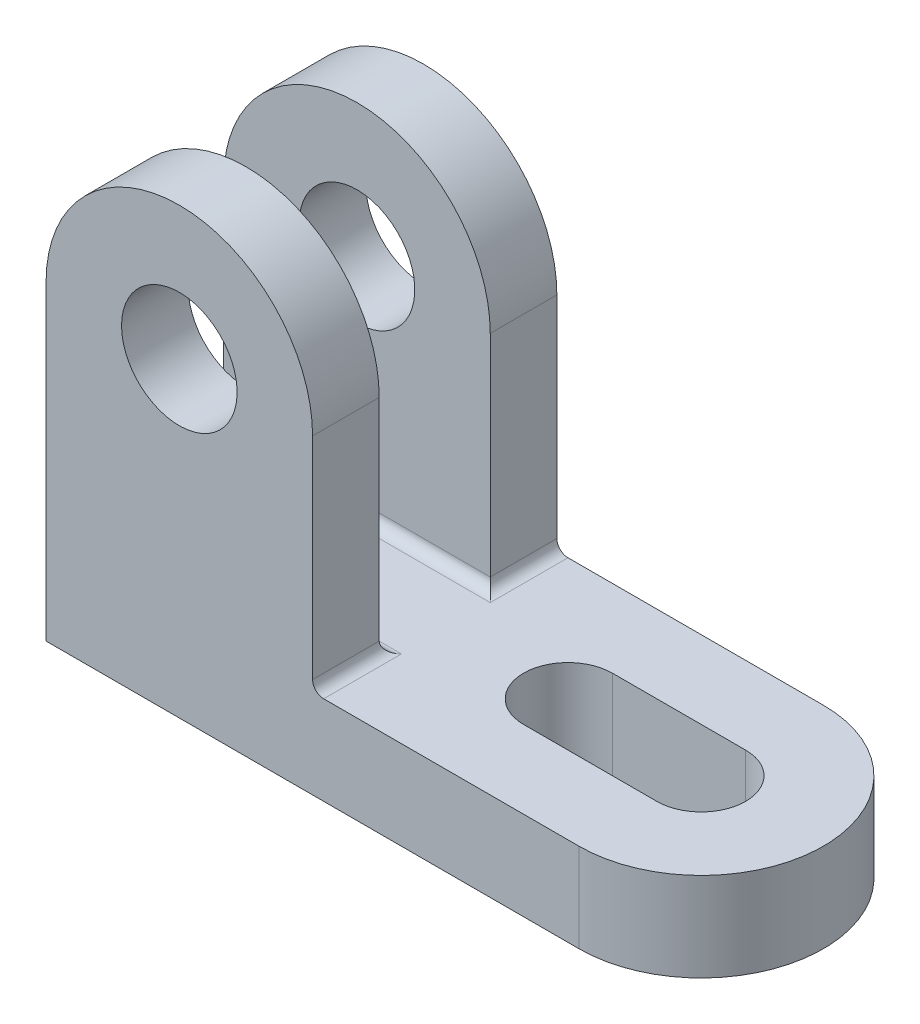
ISO-10303-21;
HEADER;
FILE_DESCRIPTION(('STEP AP214'),'2;1');
FILE_NAME('part.step','',(''),(''),'','','');
FILE_SCHEMA(('AUTOMOTIVE_DESIGN { 1 0 10303 214 1 1 1 1 }'));
ENDSEC;
DATA;
#1=APPLICATION_CONTEXT('core data for automotive mechanical design processes');
#2=APPLICATION_PROTOCOL_DEFINITION('international standard','automotive_design',2000,#1);
#3=PRODUCT_CONTEXT('',#1,'mechanical');
#4=PRODUCT('Part','Part','',(#3));
#5=PRODUCT_RELATED_PRODUCT_CATEGORY('part','',(#4));
#6=PRODUCT_DEFINITION_FORMATION('','',#4);
#7=PRODUCT_DEFINITION_CONTEXT('part definition',#1,'design');
#8=PRODUCT_DEFINITION('design','',#6,#7);
#9=PRODUCT_DEFINITION_SHAPE('','',#8);
#10=(LENGTH_UNIT() NAMED_UNIT(*) SI_UNIT(.MILLI.,.METRE.));
#11=(NAMED_UNIT(*) PLANE_ANGLE_UNIT() SI_UNIT($,.RADIAN.));
#12=(NAMED_UNIT(*) SI_UNIT($,.STERADIAN.) SOLID_ANGLE_UNIT());
#13=UNCERTAINTY_MEASURE_WITH_UNIT(LENGTH_MEASURE(1.E-05),#10,'distance_accuracy_value','');
#14=(GEOMETRIC_REPRESENTATION_CONTEXT(3) GLOBAL_UNCERTAINTY_ASSIGNED_CONTEXT((#13)) GLOBAL_UNIT_ASSIGNED_CONTEXT((#10,
#11,#12)) REPRESENTATION_CONTEXT('',''));
#15=CARTESIAN_POINT('',(0.,0.,0.));
#16=DIRECTION('',(0.,0.,1.));
#17=DIRECTION('',(1.,0.,0.));
#18=AXIS2_PLACEMENT_3D('',#15,#16,#17);
#19=CARTESIAN_POINT('',(-59.,16.,22.));
#20=DIRECTION('',(1.,0.,0.));
#21=DIRECTION('',(0.,0.,-1.));
#22=AXIS2_PLACEMENT_3D('',#19,#20,#21);
#23=PLANE('',#22);
#24=DIRECTION('',(0.,0.,1.));
#25=VECTOR('',#24,1.);
#26=CARTESIAN_POINT('',(-59.,0.,22.));
#27=LINE('',#26,#25);
#28=CARTESIAN_POINT('',(-59.,0.,-22.));
#29=VERTEX_POINT('',#28);
#30=CARTESIAN_POINT('',(-59.,0.,22.));
#31=VERTEX_POINT('',#30);
#32=EDGE_CURVE('E246',#29,#31,#27,.T.);
#33=ORIENTED_EDGE('',*,*,#32,.T.);
#34=DIRECTION('',(0.,-1.,0.));
#35=VECTOR('',#34,1.);
#36=CARTESIAN_POINT('',(-59.,16.,22.));
#37=LINE('',#36,#35);
#38=CARTESIAN_POINT('',(-59.,56.,22.));
#39=VERTEX_POINT('',#38);
#40=EDGE_CURVE('E173',#39,#31,#37,.T.);
#41=ORIENTED_EDGE('',*,*,#40,.F.);
#42=DIRECTION('',(0.,0.,1.));
#43=VECTOR('',#42,1.);
#44=CARTESIAN_POINT('',(-59.,56.,10.));
#45=LINE('',#44,#43);
#46=CARTESIAN_POINT('',(-59.,56.,10.));
#47=VERTEX_POINT('',#46);
#48=EDGE_CURVE('E170',#47,#39,#45,.T.);
#49=ORIENTED_EDGE('',*,*,#48,.F.);
#50=DIRECTION('',(0.,1.,0.));
#51=VECTOR('',#50,1.);
#52=CARTESIAN_POINT('',(-59.,0.,10.));
#53=LINE('',#52,#51);
#54=CARTESIAN_POINT('',(-59.,18.,10.));
#55=VERTEX_POINT('',#54);
#56=EDGE_CURVE('E158',#55,#47,#53,.T.);
#57=ORIENTED_EDGE('',*,*,#56,.F.);
#58=CARTESIAN_POINT('',(-59.,18.,8.));
#59=DIRECTION('',(1.,0.,0.));
#60=DIRECTION('',(0.,0.,-1.));
#61=AXIS2_PLACEMENT_3D('',#58,#59,#60);
#62=CIRCLE('',#61,2.);
#63=CARTESIAN_POINT('',(-59.,16.,8.));
#64=VERTEX_POINT('',#63);
#65=EDGE_CURVE('E11',#55,#64,#62,.T.);
#66=ORIENTED_EDGE('',*,*,#65,.T.);
#67=DIRECTION('',(0.,0.,1.));
#68=VECTOR('',#67,1.);
#69=CARTESIAN_POINT('',(-59.,16.,22.));
#70=LINE('',#69,#68);
#71=CARTESIAN_POINT('',(-59.,16.,-8.));
#72=VERTEX_POINT('',#71);
#73=EDGE_CURVE('E253',#72,#64,#70,.T.);
#74=ORIENTED_EDGE('',*,*,#73,.F.);
#75=CARTESIAN_POINT('',(-59.,18.,-8.));
#76=DIRECTION('',(1.,0.,0.));
#77=DIRECTION('',(0.,0.,-1.));
#78=AXIS2_PLACEMENT_3D('',#75,#76,#77);
#79=CIRCLE('',#78,2.);
#80=CARTESIAN_POINT('',(-59.,18.,-10.));
#81=VERTEX_POINT('',#80);
#82=EDGE_CURVE('E298',#72,#81,#79,.T.);
#83=ORIENTED_EDGE('',*,*,#82,.T.);
#84=DIRECTION('',(0.,1.,0.));
#85=VECTOR('',#84,1.);
#86=CARTESIAN_POINT('',(-59.,0.,-10.));
#87=LINE('',#86,#85);
#88=CARTESIAN_POINT('',(-59.,56.,-10.));
#89=VERTEX_POINT('',#88);
#90=EDGE_CURVE('E203',#81,#89,#87,.T.);
#91=ORIENTED_EDGE('',*,*,#90,.T.);
#92=DIRECTION('',(0.,0.,-1.));
#93=VECTOR('',#92,1.);
#94=CARTESIAN_POINT('',(-59.,56.,-10.));
#95=LINE('',#94,#93);
#96=CARTESIAN_POINT('',(-59.,56.,-22.));
#97=VERTEX_POINT('',#96);
#98=EDGE_CURVE('E215',#89,#97,#95,.T.);
#99=ORIENTED_EDGE('',*,*,#98,.T.);
#100=DIRECTION('',(0.,-1.,0.));
#101=VECTOR('',#100,1.);
#102=CARTESIAN_POINT('',(-59.,16.,-22.));
#103=LINE('',#102,#101);
#104=EDGE_CURVE('E264',#97,#29,#103,.T.);
#105=ORIENTED_EDGE('',*,*,#104,.T.);
#106=EDGE_LOOP('',(#33,#41,#49,#57,#66,#74,#83,#91,#99,#105));
#107=FACE_BOUND('',#106,.T.);
#108=ADVANCED_FACE('F39',(#107),#23,.F.);
#109=CARTESIAN_POINT('',(-59.,16.,22.));
#110=DIRECTION('',(0.,0.,-1.));
#111=DIRECTION('',(-1.,0.,0.));
#112=AXIS2_PLACEMENT_3D('',#109,#110,#111);
#113=PLANE('',#112);
#114=DIRECTION('',(1.,0.,0.));
#115=VECTOR('',#114,1.);
#116=CARTESIAN_POINT('',(-59.,0.,22.));
#117=LINE('',#116,#115);
#118=CARTESIAN_POINT('',(37.,0.,22.));
#119=VERTEX_POINT('',#118);
#120=EDGE_CURVE('E266',#31,#119,#117,.T.);
#121=ORIENTED_EDGE('',*,*,#120,.T.);
#122=DIRECTION('',(0.,-1.,0.));
#123=VECTOR('',#122,1.);
#124=CARTESIAN_POINT('',(37.,16.,22.));
#125=LINE('',#124,#123);
#126=CARTESIAN_POINT('',(37.,16.,22.));
#127=VERTEX_POINT('',#126);
#128=EDGE_CURVE('E276',#127,#119,#125,.T.);
#129=ORIENTED_EDGE('',*,*,#128,.F.);
#130=DIRECTION('',(1.,0.,0.));
#131=VECTOR('',#130,1.);
#132=CARTESIAN_POINT('',(-59.,16.,22.));
#133=LINE('',#132,#131);
#134=CARTESIAN_POINT('',(-8.99999999999998,16.,22.));
#135=VERTEX_POINT('',#134);
#136=EDGE_CURVE('E256',#135,#127,#133,.T.);
#137=ORIENTED_EDGE('',*,*,#136,.F.);
#138=CARTESIAN_POINT('',(-8.99999999999998,18.,22.));
#139=DIRECTION('',(0.,0.,-1.));
#140=DIRECTION('',(-1.,0.,0.));
#141=AXIS2_PLACEMENT_3D('',#138,#139,#140);
#142=CIRCLE('',#141,2.);
#143=CARTESIAN_POINT('',(-11.,18.,22.));
#144=VERTEX_POINT('',#143);
#145=EDGE_CURVE('E48',#135,#144,#142,.T.);
#146=ORIENTED_EDGE('',*,*,#145,.T.);
#147=DIRECTION('',(0.,1.,0.));
#148=VECTOR('',#147,1.);
#149=CARTESIAN_POINT('',(-11.,0.,22.));
#150=LINE('',#149,#148);
#151=CARTESIAN_POINT('',(-11.,56.,22.));
#152=VERTEX_POINT('',#151);
#153=EDGE_CURVE('E185',#144,#152,#150,.T.);
#154=ORIENTED_EDGE('',*,*,#153,.T.);
#155=CARTESIAN_POINT('',(-35.,56.,22.));
#156=DIRECTION('',(0.,0.,-1.));
#157=DIRECTION('',(-1.,0.,0.));
#158=AXIS2_PLACEMENT_3D('',#155,#156,#157);
#159=CIRCLE('',#158,24.);
#160=EDGE_CURVE('E191',#39,#152,#159,.T.);
#161=ORIENTED_EDGE('',*,*,#160,.F.);
#162=ORIENTED_EDGE('',*,*,#40,.T.);
#163=EDGE_LOOP('',(#121,#129,#137,#146,#154,#161,#162));
#164=FACE_BOUND('',#163,.T.);
#165=CARTESIAN_POINT('',(-35.,56.,22.));
#166=DIRECTION('',(0.,0.,-1.));
#167=DIRECTION('',(-1.,0.,0.));
#168=AXIS2_PLACEMENT_3D('',#165,#166,#167);
#169=CIRCLE('',#168,10.4088317017325);
#170=CARTESIAN_POINT('',(-45.4088317017325,56.,22.));
#171=VERTEX_POINT('',#170);
#172=EDGE_CURVE('E182',#171,#171,#169,.T.);
#173=ORIENTED_EDGE('',*,*,#172,.T.);
#174=EDGE_LOOP('',(#173));
#175=FACE_BOUND('',#174,.T.);
#176=ADVANCED_FACE('F340',(#164,#175),#113,.F.);
#177=CARTESIAN_POINT('',(37.,16.,0.));
#178=DIRECTION('',(0.,-1.,0.));
#179=DIRECTION('',(0.,0.,-1.));
#180=AXIS2_PLACEMENT_3D('',#177,#178,#179);
#181=CYLINDRICAL_SURFACE('',#180,22.);
#182=CARTESIAN_POINT('',(37.,0.,0.));
#183=DIRECTION('',(0.,1.,0.));
#184=DIRECTION('',(0.,0.,1.));
#185=AXIS2_PLACEMENT_3D('',#182,#183,#184);
#186=CIRCLE('',#185,22.);
#187=CARTESIAN_POINT('',(37.,0.,-22.));
#188=VERTEX_POINT('',#187);
#189=EDGE_CURVE('E268',#119,#188,#186,.T.);
#190=ORIENTED_EDGE('',*,*,#189,.T.);
#191=DIRECTION('',(0.,-1.,0.));
#192=VECTOR('',#191,1.);
#193=CARTESIAN_POINT('',(37.,16.,-22.));
#194=LINE('',#193,#192);
#195=CARTESIAN_POINT('',(37.,16.,-22.));
#196=VERTEX_POINT('',#195);
#197=EDGE_CURVE('E273',#196,#188,#194,.T.);
#198=ORIENTED_EDGE('',*,*,#197,.F.);
#199=CARTESIAN_POINT('',(37.,16.,0.));
#200=DIRECTION('',(0.,1.,0.));
#201=DIRECTION('',(0.,0.,1.));
#202=AXIS2_PLACEMENT_3D('',#199,#200,#201);
#203=CIRCLE('',#202,22.);
#204=EDGE_CURVE('E259',#127,#196,#203,.T.);
#205=ORIENTED_EDGE('',*,*,#204,.F.);
#206=ORIENTED_EDGE('',*,*,#128,.T.);
#207=EDGE_LOOP('',(#190,#198,#205,#206));
#208=FACE_BOUND('',#207,.T.);
#209=ADVANCED_FACE('F361',(#208),#181,.T.);
#210=CARTESIAN_POINT('',(-59.,16.,-22.));
#211=DIRECTION('',(0.,0.,1.));
#212=DIRECTION('',(1.,0.,0.));
#213=AXIS2_PLACEMENT_3D('',#210,#211,#212);
#214=PLANE('',#213);
#215=DIRECTION('',(-1.,0.,0.));
#216=VECTOR('',#215,1.);
#217=CARTESIAN_POINT('',(-59.,0.,-22.));
#218=LINE('',#217,#216);
#219=EDGE_CURVE('E257',#188,#29,#218,.T.);
#220=ORIENTED_EDGE('',*,*,#219,.T.);
#221=ORIENTED_EDGE('',*,*,#104,.F.);
#222=CARTESIAN_POINT('',(-35.,56.,-22.));
#223=DIRECTION('',(0.,0.,-1.));
#224=DIRECTION('',(-1.,0.,0.));
#225=AXIS2_PLACEMENT_3D('',#222,#223,#224);
#226=CIRCLE('',#225,24.);
#227=CARTESIAN_POINT('',(-11.,56.,-22.));
#228=VERTEX_POINT('',#227);
#229=EDGE_CURVE('E195',#97,#228,#226,.T.);
#230=ORIENTED_EDGE('',*,*,#229,.T.);
#231=DIRECTION('',(0.,1.,0.));
#232=VECTOR('',#231,1.);
#233=CARTESIAN_POINT('',(-11.,0.,-22.));
#234=LINE('',#233,#232);
#235=CARTESIAN_POINT('',(-11.,18.,-22.));
#236=VERTEX_POINT('',#235);
#237=EDGE_CURVE('E211',#236,#228,#234,.T.);
#238=ORIENTED_EDGE('',*,*,#237,.F.);
#239=CARTESIAN_POINT('',(-8.99999999999998,18.,-22.));
#240=DIRECTION('',(0.,0.,1.));
#241=DIRECTION('',(1.,0.,0.));
#242=AXIS2_PLACEMENT_3D('',#239,#240,#241);
#243=CIRCLE('',#242,2.);
#244=CARTESIAN_POINT('',(-8.99999999999998,16.,-22.));
#245=VERTEX_POINT('',#244);
#246=EDGE_CURVE('E296',#236,#245,#243,.T.);
#247=ORIENTED_EDGE('',*,*,#246,.T.);
#248=DIRECTION('',(-1.,0.,0.));
#249=VECTOR('',#248,1.);
#250=CARTESIAN_POINT('',(-59.,16.,-22.));
#251=LINE('',#250,#249);
#252=EDGE_CURVE('E261',#196,#245,#251,.T.);
#253=ORIENTED_EDGE('',*,*,#252,.F.);
#254=ORIENTED_EDGE('',*,*,#197,.T.);
#255=EDGE_LOOP('',(#220,#221,#230,#238,#247,#253,#254));
#256=FACE_BOUND('',#255,.T.);
#257=CARTESIAN_POINT('',(-35.,56.,-22.));
#258=DIRECTION('',(0.,0.,-1.));
#259=DIRECTION('',(-1.,0.,0.));
#260=AXIS2_PLACEMENT_3D('',#257,#258,#259);
#261=CIRCLE('',#260,10.4088317017325);
#262=CARTESIAN_POINT('',(-45.4088317017325,56.,-22.));
#263=VERTEX_POINT('',#262);
#264=EDGE_CURVE('E201',#263,#263,#261,.T.);
#265=ORIENTED_EDGE('',*,*,#264,.F.);
#266=EDGE_LOOP('',(#265));
#267=FACE_BOUND('',#266,.T.);
#268=ADVANCED_FACE('F428',(#256,#267),#214,.F.);
#269=CARTESIAN_POINT('',(37.,16.,0.));
#270=DIRECTION('',(0.,1.,0.));
#271=DIRECTION('',(0.,0.,1.));
#272=AXIS2_PLACEMENT_3D('',#269,#270,#271);
#273=PLANE('',#272);
#274=ORIENTED_EDGE('',*,*,#252,.T.);
#275=DIRECTION('',(0.,0.,-1.));
#276=VECTOR('',#275,1.);
#277=CARTESIAN_POINT('',(-8.99999999999998,16.,0.));
#278=LINE('',#277,#276);
#279=CARTESIAN_POINT('',(-8.99999999999998,16.,-8.));
#280=VERTEX_POINT('',#279);
#281=EDGE_CURVE('E290',#245,#280,#278,.F.);
#282=ORIENTED_EDGE('',*,*,#281,.T.);
#283=DIRECTION('',(1.,0.,0.));
#284=VECTOR('',#283,1.);
#285=CARTESIAN_POINT('',(37.,16.,-8.));
#286=LINE('',#285,#284);
#287=EDGE_CURVE('E288',#280,#72,#286,.F.);
#288=ORIENTED_EDGE('',*,*,#287,.T.);
#289=ORIENTED_EDGE('',*,*,#73,.T.);
#290=DIRECTION('',(1.,0.,0.));
#291=VECTOR('',#290,1.);
#292=CARTESIAN_POINT('',(37.,16.,8.));
#293=LINE('',#292,#291);
#294=CARTESIAN_POINT('',(-8.99999999999998,16.,8.));
#295=VERTEX_POINT('',#294);
#296=EDGE_CURVE('E283',#64,#295,#293,.T.);
#297=ORIENTED_EDGE('',*,*,#296,.T.);
#298=DIRECTION('',(0.,0.,1.));
#299=VECTOR('',#298,1.);
#300=CARTESIAN_POINT('',(-8.99999999999998,16.,22.));
#301=LINE('',#300,#299);
#302=EDGE_CURVE('E285',#295,#135,#301,.T.);
#303=ORIENTED_EDGE('',*,*,#302,.T.);
#304=ORIENTED_EDGE('',*,*,#136,.T.);
#305=ORIENTED_EDGE('',*,*,#204,.T.);
#306=EDGE_LOOP('',(#274,#282,#288,#289,#297,#303,#304,#305));
#307=FACE_BOUND('',#306,.T.);
#308=CARTESIAN_POINT('',(37.,16.,0.));
#309=DIRECTION('',(0.,1.,0.));
#310=DIRECTION('',(0.,0.,1.));
#311=AXIS2_PLACEMENT_3D('',#308,#309,#310);
#312=CIRCLE('',#311,8.);
#313=CARTESIAN_POINT('',(37.,16.,8.));
#314=VERTEX_POINT('',#313);
#315=CARTESIAN_POINT('',(37.,16.,-8.));
#316=VERTEX_POINT('',#315);
#317=EDGE_CURVE('E218',#314,#316,#312,.T.);
#318=ORIENTED_EDGE('',*,*,#317,.F.);
#319=DIRECTION('',(1.,0.,0.));
#320=VECTOR('',#319,1.);
#321=CARTESIAN_POINT('',(37.,16.,8.));
#322=LINE('',#321,#320);
#323=CARTESIAN_POINT('',(13.,16.,8.));
#324=VERTEX_POINT('',#323);
#325=EDGE_CURVE('E225',#324,#314,#322,.T.);
#326=ORIENTED_EDGE('',*,*,#325,.F.);
#327=CARTESIAN_POINT('',(13.,16.,0.));
#328=DIRECTION('',(0.,1.,0.));
#329=DIRECTION('',(0.,0.,1.));
#330=AXIS2_PLACEMENT_3D('',#327,#328,#329);
#331=CIRCLE('',#330,8.);
#332=CARTESIAN_POINT('',(13.,16.,-8.));
#333=VERTEX_POINT('',#332);
#334=EDGE_CURVE('E239',#333,#324,#331,.T.);
#335=ORIENTED_EDGE('',*,*,#334,.F.);
#336=DIRECTION('',(-1.,0.,0.));
#337=VECTOR('',#336,1.);
#338=CARTESIAN_POINT('',(37.,16.,-8.));
#339=LINE('',#338,#337);
#340=EDGE_CURVE('E236',#316,#333,#339,.T.);
#341=ORIENTED_EDGE('',*,*,#340,.F.);
#342=EDGE_LOOP('',(#318,#326,#335,#341));
#343=FACE_BOUND('',#342,.T.);
#344=ADVANCED_FACE('F315',(#307,#343),#273,.T.);
#345=CARTESIAN_POINT('',(37.,0.,0.));
#346=DIRECTION('',(0.,1.,0.));
#347=DIRECTION('',(0.,0.,1.));
#348=AXIS2_PLACEMENT_3D('',#345,#346,#347);
#349=PLANE('',#348);
#350=DIRECTION('',(1.,0.,0.));
#351=VECTOR('',#350,1.);
#352=CARTESIAN_POINT('',(37.,0.,8.));
#353=LINE('',#352,#351);
#354=CARTESIAN_POINT('',(13.,0.,8.));
#355=VERTEX_POINT('',#354);
#356=CARTESIAN_POINT('',(37.,0.,8.));
#357=VERTEX_POINT('',#356);
#358=EDGE_CURVE('E231',#355,#357,#353,.T.);
#359=ORIENTED_EDGE('',*,*,#358,.T.);
#360=CARTESIAN_POINT('',(37.,0.,0.));
#361=DIRECTION('',(0.,1.,0.));
#362=DIRECTION('',(0.,0.,1.));
#363=AXIS2_PLACEMENT_3D('',#360,#361,#362);
#364=CIRCLE('',#363,8.);
#365=CARTESIAN_POINT('',(37.,0.,-8.));
#366=VERTEX_POINT('',#365);
#367=EDGE_CURVE('E221',#357,#366,#364,.T.);
#368=ORIENTED_EDGE('',*,*,#367,.T.);
#369=DIRECTION('',(-1.,0.,0.));
#370=VECTOR('',#369,1.);
#371=CARTESIAN_POINT('',(37.,0.,-8.));
#372=LINE('',#371,#370);
#373=CARTESIAN_POINT('',(13.,0.,-8.));
#374=VERTEX_POINT('',#373);
#375=EDGE_CURVE('E224',#366,#374,#372,.T.);
#376=ORIENTED_EDGE('',*,*,#375,.T.);
#377=CARTESIAN_POINT('',(13.,0.,0.));
#378=DIRECTION('',(0.,1.,0.));
#379=DIRECTION('',(0.,0.,1.));
#380=AXIS2_PLACEMENT_3D('',#377,#378,#379);
#381=CIRCLE('',#380,8.);
#382=EDGE_CURVE('E228',#374,#355,#381,.T.);
#383=ORIENTED_EDGE('',*,*,#382,.T.);
#384=EDGE_LOOP('',(#359,#368,#376,#383));
#385=FACE_BOUND('',#384,.T.);
#386=ORIENTED_EDGE('',*,*,#32,.F.);
#387=ORIENTED_EDGE('',*,*,#219,.F.);
#388=ORIENTED_EDGE('',*,*,#189,.F.);
#389=ORIENTED_EDGE('',*,*,#120,.F.);
#390=EDGE_LOOP('',(#386,#387,#388,#389));
#391=FACE_BOUND('',#390,.T.);
#392=ADVANCED_FACE('F336',(#385,#391),#349,.F.);
#393=CARTESIAN_POINT('',(37.,0.,0.));
#394=DIRECTION('',(0.,1.,0.));
#395=DIRECTION('',(0.,0.,1.));
#396=AXIS2_PLACEMENT_3D('',#393,#394,#395);
#397=CYLINDRICAL_SURFACE('',#396,8.);
#398=ORIENTED_EDGE('',*,*,#317,.T.);
#399=DIRECTION('',(0.,1.,0.));
#400=VECTOR('',#399,1.);
#401=CARTESIAN_POINT('',(37.,0.,-8.));
#402=LINE('',#401,#400);
#403=EDGE_CURVE('E234',#366,#316,#402,.T.);
#404=ORIENTED_EDGE('',*,*,#403,.F.);
#405=ORIENTED_EDGE('',*,*,#367,.F.);
#406=DIRECTION('',(0.,1.,0.));
#407=VECTOR('',#406,1.);
#408=CARTESIAN_POINT('',(37.,0.,8.));
#409=LINE('',#408,#407);
#410=EDGE_CURVE('E244',#357,#314,#409,.T.);
#411=ORIENTED_EDGE('',*,*,#410,.T.);
#412=EDGE_LOOP('',(#398,#404,#405,#411));
#413=FACE_BOUND('',#412,.T.);
#414=ADVANCED_FACE('F504',(#413),#397,.F.);
#415=CARTESIAN_POINT('',(37.,0.,8.));
#416=DIRECTION('',(0.,0.,1.));
#417=DIRECTION('',(1.,0.,0.));
#418=AXIS2_PLACEMENT_3D('',#415,#416,#417);
#419=PLANE('',#418);
#420=ORIENTED_EDGE('',*,*,#325,.T.);
#421=ORIENTED_EDGE('',*,*,#410,.F.);
#422=ORIENTED_EDGE('',*,*,#358,.F.);
#423=DIRECTION('',(0.,1.,0.));
#424=VECTOR('',#423,1.);
#425=CARTESIAN_POINT('',(13.,0.,8.));
#426=LINE('',#425,#424);
#427=EDGE_CURVE('E247',#355,#324,#426,.T.);
#428=ORIENTED_EDGE('',*,*,#427,.T.);
#429=EDGE_LOOP('',(#420,#421,#422,#428));
#430=FACE_BOUND('',#429,.T.);
#431=ADVANCED_FACE('F513',(#430),#419,.F.);
#432=CARTESIAN_POINT('',(13.,0.,0.));
#433=DIRECTION('',(0.,1.,0.));
#434=DIRECTION('',(0.,0.,1.));
#435=AXIS2_PLACEMENT_3D('',#432,#433,#434);
#436=CYLINDRICAL_SURFACE('',#435,8.);
#437=ORIENTED_EDGE('',*,*,#334,.T.);
#438=ORIENTED_EDGE('',*,*,#427,.F.);
#439=ORIENTED_EDGE('',*,*,#382,.F.);
#440=DIRECTION('',(0.,1.,0.));
#441=VECTOR('',#440,1.);
#442=CARTESIAN_POINT('',(13.,0.,-8.));
#443=LINE('',#442,#441);
#444=EDGE_CURVE('E249',#374,#333,#443,.T.);
#445=ORIENTED_EDGE('',*,*,#444,.T.);
#446=EDGE_LOOP('',(#437,#438,#439,#445));
#447=FACE_BOUND('',#446,.T.);
#448=ADVANCED_FACE('F522',(#447),#436,.F.);
#449=CARTESIAN_POINT('',(37.,0.,-8.));
#450=DIRECTION('',(0.,0.,-1.));
#451=DIRECTION('',(-1.,0.,0.));
#452=AXIS2_PLACEMENT_3D('',#449,#450,#451);
#453=PLANE('',#452);
#454=ORIENTED_EDGE('',*,*,#340,.T.);
#455=ORIENTED_EDGE('',*,*,#444,.F.);
#456=ORIENTED_EDGE('',*,*,#375,.F.);
#457=ORIENTED_EDGE('',*,*,#403,.T.);
#458=EDGE_LOOP('',(#454,#455,#456,#457));
#459=FACE_BOUND('',#458,.T.);
#460=ADVANCED_FACE('F531',(#459),#453,.F.);
#461=CARTESIAN_POINT('',(-35.,56.,-10.));
#462=DIRECTION('',(0.,0.,-1.));
#463=DIRECTION('',(-1.,0.,0.));
#464=AXIS2_PLACEMENT_3D('',#461,#462,#463);
#465=CYLINDRICAL_SURFACE('',#464,24.);
#466=ORIENTED_EDGE('',*,*,#229,.F.);
#467=ORIENTED_EDGE('',*,*,#98,.F.);
#468=CARTESIAN_POINT('',(-35.,56.,-10.));
#469=DIRECTION('',(0.,0.,-1.));
#470=DIRECTION('',(-1.,0.,0.));
#471=AXIS2_PLACEMENT_3D('',#468,#469,#470);
#472=CIRCLE('',#471,24.);
#473=CARTESIAN_POINT('',(-11.,56.,-10.));
#474=VERTEX_POINT('',#473);
#475=EDGE_CURVE('E197',#89,#474,#472,.T.);
#476=ORIENTED_EDGE('',*,*,#475,.T.);
#477=DIRECTION('',(0.,0.,-1.));
#478=VECTOR('',#477,1.);
#479=CARTESIAN_POINT('',(-11.,56.,-10.));
#480=LINE('',#479,#478);
#481=EDGE_CURVE('E208',#474,#228,#480,.T.);
#482=ORIENTED_EDGE('',*,*,#481,.T.);
#483=EDGE_LOOP('',(#466,#467,#476,#482));
#484=FACE_BOUND('',#483,.T.);
#485=ADVANCED_FACE('F331',(#484),#465,.T.);
#486=CARTESIAN_POINT('',(-11.,0.,-10.));
#487=DIRECTION('',(-1.,0.,0.));
#488=DIRECTION('',(0.,0.,1.));
#489=AXIS2_PLACEMENT_3D('',#486,#487,#488);
#490=PLANE('',#489);
#491=DIRECTION('',(0.,1.,0.));
#492=VECTOR('',#491,1.);
#493=CARTESIAN_POINT('',(-11.,0.,-10.));
#494=LINE('',#493,#492);
#495=CARTESIAN_POINT('',(-11.,18.,-10.));
#496=VERTEX_POINT('',#495);
#497=EDGE_CURVE('E200',#496,#474,#494,.T.);
#498=ORIENTED_EDGE('',*,*,#497,.F.);
#499=DIRECTION('',(0.,0.,-1.));
#500=VECTOR('',#499,1.);
#501=CARTESIAN_POINT('',(-11.,18.,-10.));
#502=LINE('',#501,#500);
#503=EDGE_CURVE('E280',#496,#236,#502,.T.);
#504=ORIENTED_EDGE('',*,*,#503,.T.);
#505=ORIENTED_EDGE('',*,*,#237,.T.);
#506=ORIENTED_EDGE('',*,*,#481,.F.);
#507=EDGE_LOOP('',(#498,#504,#505,#506));
#508=FACE_BOUND('',#507,.T.);
#509=ADVANCED_FACE('F446',(#508),#490,.F.);
#510=CARTESIAN_POINT('',(-35.,56.,-10.));
#511=DIRECTION('',(0.,0.,-1.));
#512=DIRECTION('',(-1.,0.,0.));
#513=AXIS2_PLACEMENT_3D('',#510,#511,#512);
#514=CYLINDRICAL_SURFACE('',#513,10.4088317017325);
#515=CARTESIAN_POINT('',(-35.,56.,-10.));
#516=DIRECTION('',(0.,0.,-1.));
#517=DIRECTION('',(-1.,0.,0.));
#518=AXIS2_PLACEMENT_3D('',#515,#516,#517);
#519=CIRCLE('',#518,10.4088317017325);
#520=CARTESIAN_POINT('',(-45.4088317017325,56.,-10.));
#521=VERTEX_POINT('',#520);
#522=EDGE_CURVE('E205',#521,#521,#519,.T.);
#523=ORIENTED_EDGE('',*,*,#522,.F.);
#524=EDGE_LOOP('',(#523));
#525=FACE_BOUND('',#524,.T.);
#526=ORIENTED_EDGE('',*,*,#264,.T.);
#527=EDGE_LOOP('',(#526));
#528=FACE_BOUND('',#527,.T.);
#529=ADVANCED_FACE('F449',(#525,#528),#514,.F.);
#530=CARTESIAN_POINT('',(0.,0.,-10.));
#531=DIRECTION('',(0.,0.,-1.));
#532=DIRECTION('',(-1.,0.,0.));
#533=AXIS2_PLACEMENT_3D('',#530,#531,#532);
#534=PLANE('',#533);
#535=ORIENTED_EDGE('',*,*,#90,.F.);
#536=DIRECTION('',(1.,0.,0.));
#537=VECTOR('',#536,1.);
#538=CARTESIAN_POINT('',(0.,18.,-10.));
#539=LINE('',#538,#537);
#540=EDGE_CURVE('E292',#81,#496,#539,.T.);
#541=ORIENTED_EDGE('',*,*,#540,.T.);
#542=ORIENTED_EDGE('',*,*,#497,.T.);
#543=ORIENTED_EDGE('',*,*,#475,.F.);
#544=EDGE_LOOP('',(#535,#541,#542,#543));
#545=FACE_BOUND('',#544,.T.);
#546=ORIENTED_EDGE('',*,*,#522,.T.);
#547=EDGE_LOOP('',(#546));
#548=FACE_BOUND('',#547,.T.);
#549=ADVANCED_FACE('F325',(#545,#548),#534,.F.);
#550=CARTESIAN_POINT('',(-35.,56.,10.));
#551=DIRECTION('',(0.,0.,1.));
#552=DIRECTION('',(1.,0.,0.));
#553=AXIS2_PLACEMENT_3D('',#550,#551,#552);
#554=CYLINDRICAL_SURFACE('',#553,24.);
#555=ORIENTED_EDGE('',*,*,#160,.T.);
#556=DIRECTION('',(0.,0.,1.));
#557=VECTOR('',#556,1.);
#558=CARTESIAN_POINT('',(-11.,56.,10.));
#559=LINE('',#558,#557);
#560=CARTESIAN_POINT('',(-11.,56.,10.));
#561=VERTEX_POINT('',#560);
#562=EDGE_CURVE('E177',#561,#152,#559,.T.);
#563=ORIENTED_EDGE('',*,*,#562,.F.);
#564=CARTESIAN_POINT('',(-35.,56.,10.));
#565=DIRECTION('',(0.,0.,-1.));
#566=DIRECTION('',(-1.,0.,0.));
#567=AXIS2_PLACEMENT_3D('',#564,#565,#566);
#568=CIRCLE('',#567,24.);
#569=EDGE_CURVE('E163',#47,#561,#568,.T.);
#570=ORIENTED_EDGE('',*,*,#569,.F.);
#571=ORIENTED_EDGE('',*,*,#48,.T.);
#572=EDGE_LOOP('',(#555,#563,#570,#571));
#573=FACE_BOUND('',#572,.T.);
#574=ADVANCED_FACE('F180',(#573),#554,.T.);
#575=CARTESIAN_POINT('',(-11.,0.,10.));
#576=DIRECTION('',(1.,0.,0.));
#577=DIRECTION('',(0.,0.,-1.));
#578=AXIS2_PLACEMENT_3D('',#575,#576,#577);
#579=PLANE('',#578);
#580=ORIENTED_EDGE('',*,*,#153,.F.);
#581=DIRECTION('',(0.,0.,1.));
#582=VECTOR('',#581,1.);
#583=CARTESIAN_POINT('',(-11.,18.,10.));
#584=LINE('',#583,#582);
#585=CARTESIAN_POINT('',(-11.,18.,10.));
#586=VERTEX_POINT('',#585);
#587=EDGE_CURVE('E64',#144,#586,#584,.F.);
#588=ORIENTED_EDGE('',*,*,#587,.T.);
#589=DIRECTION('',(0.,1.,0.));
#590=VECTOR('',#589,1.);
#591=CARTESIAN_POINT('',(-11.,0.,10.));
#592=LINE('',#591,#590);
#593=EDGE_CURVE('E167',#586,#561,#592,.T.);
#594=ORIENTED_EDGE('',*,*,#593,.T.);
#595=ORIENTED_EDGE('',*,*,#562,.T.);
#596=EDGE_LOOP('',(#580,#588,#594,#595));
#597=FACE_BOUND('',#596,.T.);
#598=ADVANCED_FACE('F343',(#597),#579,.T.);
#599=CARTESIAN_POINT('',(-35.,56.,10.));
#600=DIRECTION('',(0.,0.,1.));
#601=DIRECTION('',(1.,0.,0.));
#602=AXIS2_PLACEMENT_3D('',#599,#600,#601);
#603=CYLINDRICAL_SURFACE('',#602,10.4088317017325);
#604=CARTESIAN_POINT('',(-35.,56.,10.));
#605=DIRECTION('',(0.,0.,-1.));
#606=DIRECTION('',(-1.,0.,0.));
#607=AXIS2_PLACEMENT_3D('',#604,#605,#606);
#608=CIRCLE('',#607,10.4088317017325);
#609=CARTESIAN_POINT('',(-45.4088317017325,56.,10.));
#610=VERTEX_POINT('',#609);
#611=EDGE_CURVE('E178',#610,#610,#608,.T.);
#612=ORIENTED_EDGE('',*,*,#611,.T.);
#613=EDGE_LOOP('',(#612));
#614=FACE_BOUND('',#613,.T.);
#615=ORIENTED_EDGE('',*,*,#172,.F.);
#616=EDGE_LOOP('',(#615));
#617=FACE_BOUND('',#616,.T.);
#618=ADVANCED_FACE('F345',(#614,#617),#603,.F.);
#619=CARTESIAN_POINT('',(0.,0.,10.));
#620=DIRECTION('',(0.,0.,1.));
#621=DIRECTION('',(-1.,0.,0.));
#622=AXIS2_PLACEMENT_3D('',#619,#620,#621);
#623=PLANE('',#622);
#624=ORIENTED_EDGE('',*,*,#593,.F.);
#625=DIRECTION('',(1.,0.,0.));
#626=VECTOR('',#625,1.);
#627=CARTESIAN_POINT('',(0.,18.,10.));
#628=LINE('',#627,#626);
#629=EDGE_CURVE('E56',#586,#55,#628,.F.);
#630=ORIENTED_EDGE('',*,*,#629,.T.);
#631=ORIENTED_EDGE('',*,*,#56,.T.);
#632=ORIENTED_EDGE('',*,*,#569,.T.);
#633=EDGE_LOOP('',(#624,#630,#631,#632));
#634=FACE_BOUND('',#633,.T.);
#635=ORIENTED_EDGE('',*,*,#611,.F.);
#636=EDGE_LOOP('',(#635));
#637=FACE_BOUND('',#636,.T.);
#638=ADVANCED_FACE('F160',(#634,#637),#623,.F.);
#639=CARTESIAN_POINT('',(0.,18.,-8.));
#640=DIRECTION('',(1.,0.,0.));
#641=DIRECTION('',(0.,0.,-1.));
#642=AXIS2_PLACEMENT_3D('',#639,#640,#641);
#643=CYLINDRICAL_SURFACE('',#642,2.);
#644=ORIENTED_EDGE('',*,*,#82,.F.);
#645=ORIENTED_EDGE('',*,*,#287,.F.);
#646=CARTESIAN_POINT('',(-8.99999999999998,18.,-8.));
#647=DIRECTION('',(0.707106781186547,0.,-0.707106781186547));
#648=DIRECTION('',(0.707106781186547,0.,0.707106781186547));
#649=AXIS2_PLACEMENT_3D('',#646,#647,#648);
#650=ELLIPSE('',#649,2.82842712474619,2.);
#651=EDGE_CURVE('E193',#496,#280,#650,.F.);
#652=ORIENTED_EDGE('',*,*,#651,.F.);
#653=ORIENTED_EDGE('',*,*,#540,.F.);
#654=EDGE_LOOP('',(#644,#645,#652,#653));
#655=FACE_BOUND('',#654,.T.);
#656=ADVANCED_FACE('F319',(#655),#643,.F.);
#657=CARTESIAN_POINT('',(-8.99999999999998,18.,-10.));
#658=DIRECTION('',(0.,0.,-1.));
#659=DIRECTION('',(-1.,0.,0.));
#660=AXIS2_PLACEMENT_3D('',#657,#658,#659);
#661=CYLINDRICAL_SURFACE('',#660,2.);
#662=ORIENTED_EDGE('',*,*,#651,.T.);
#663=ORIENTED_EDGE('',*,*,#281,.F.);
#664=ORIENTED_EDGE('',*,*,#246,.F.);
#665=ORIENTED_EDGE('',*,*,#503,.F.);
#666=EDGE_LOOP('',(#662,#663,#664,#665));
#667=FACE_BOUND('',#666,.T.);
#668=ADVANCED_FACE('F365',(#667),#661,.F.);
#669=CARTESIAN_POINT('',(37.,18.,8.));
#670=DIRECTION('',(1.,0.,0.));
#671=DIRECTION('',(0.,0.,-1.));
#672=AXIS2_PLACEMENT_3D('',#669,#670,#671);
#673=CYLINDRICAL_SURFACE('',#672,2.);
#674=ORIENTED_EDGE('',*,*,#65,.F.);
#675=ORIENTED_EDGE('',*,*,#629,.F.);
#676=CARTESIAN_POINT('',(-8.99999999999998,18.,8.));
#677=DIRECTION('',(0.707106781186547,0.,0.707106781186547));
#678=DIRECTION('',(0.707106781186547,0.,-0.707106781186547));
#679=AXIS2_PLACEMENT_3D('',#676,#677,#678);
#680=ELLIPSE('',#679,2.82842712474619,2.);
#681=EDGE_CURVE('E43',#295,#586,#680,.F.);
#682=ORIENTED_EDGE('',*,*,#681,.F.);
#683=ORIENTED_EDGE('',*,*,#296,.F.);
#684=EDGE_LOOP('',(#674,#675,#682,#683));
#685=FACE_BOUND('',#684,.T.);
#686=ADVANCED_FACE('F41',(#685),#673,.F.);
#687=CARTESIAN_POINT('',(-8.99999999999998,18.,0.));
#688=DIRECTION('',(0.,0.,-1.));
#689=DIRECTION('',(-1.,0.,0.));
#690=AXIS2_PLACEMENT_3D('',#687,#688,#689);
#691=CYLINDRICAL_SURFACE('',#690,2.);
#692=ORIENTED_EDGE('',*,*,#681,.T.);
#693=ORIENTED_EDGE('',*,*,#587,.F.);
#694=ORIENTED_EDGE('',*,*,#145,.F.);
#695=ORIENTED_EDGE('',*,*,#302,.F.);
#696=EDGE_LOOP('',(#692,#693,#694,#695));
#697=FACE_BOUND('',#696,.T.);
#698=ADVANCED_FACE('F309',(#697),#691,.F.);
#699=CLOSED_SHELL('',(#108,#176,#209,#268,#344,#392,#414,#431,#448,#460,#485,#509,#529,#549,
#574,#598,#618,#638,#656,#668,#686,#698));
#700=MANIFOLD_SOLID_BREP('B2',#699);
#701=ADVANCED_BREP_SHAPE_REPRESENTATION('',(#18,#700),#14);
#702=SHAPE_DEFINITION_REPRESENTATION(#9,#701);
ENDSEC;
END-ISO-10303-21;
